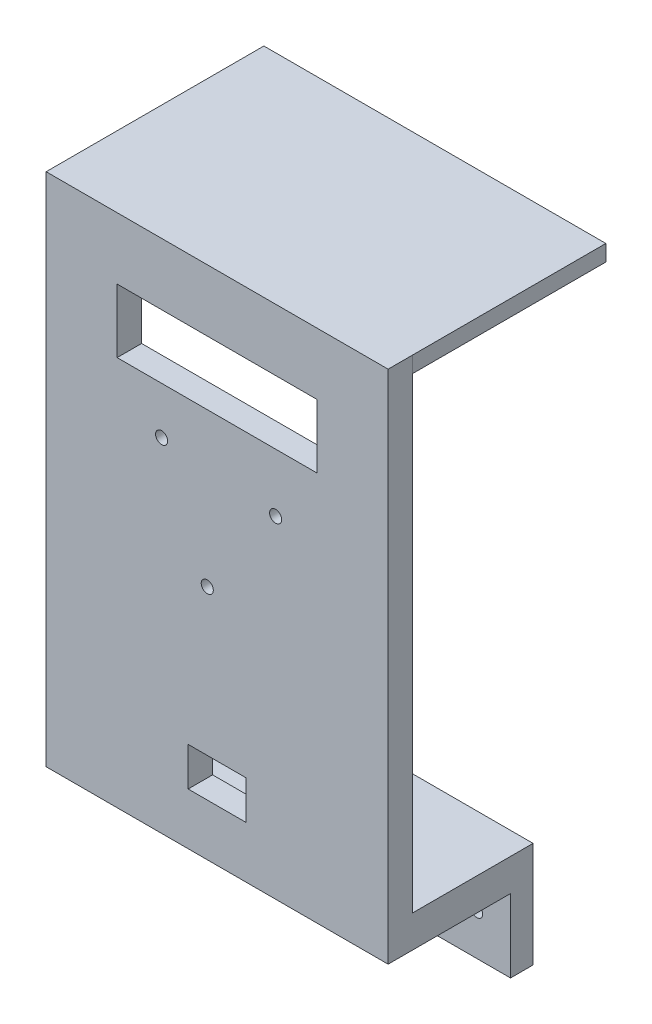
ISO-10303-21;
HEADER;
FILE_DESCRIPTION(('STEP AP214'),'2;1');
FILE_NAME('part.step','',(''),(''),'','','');
FILE_SCHEMA(('AUTOMOTIVE_DESIGN { 1 0 10303 214 1 1 1 1 }'));
ENDSEC;
DATA;
#1=APPLICATION_CONTEXT('core data for automotive mechanical design processes');
#2=APPLICATION_PROTOCOL_DEFINITION('international standard','automotive_design',2000,#1);
#3=PRODUCT_CONTEXT('',#1,'mechanical');
#4=PRODUCT('Part','Part','',(#3));
#5=PRODUCT_RELATED_PRODUCT_CATEGORY('part','',(#4));
#6=PRODUCT_DEFINITION_FORMATION('','',#4);
#7=PRODUCT_DEFINITION_CONTEXT('part definition',#1,'design');
#8=PRODUCT_DEFINITION('design','',#6,#7);
#9=PRODUCT_DEFINITION_SHAPE('','',#8);
#10=(LENGTH_UNIT() NAMED_UNIT(*) SI_UNIT(.MILLI.,.METRE.));
#11=(NAMED_UNIT(*) PLANE_ANGLE_UNIT() SI_UNIT($,.RADIAN.));
#12=(NAMED_UNIT(*) SI_UNIT($,.STERADIAN.) SOLID_ANGLE_UNIT());
#13=UNCERTAINTY_MEASURE_WITH_UNIT(LENGTH_MEASURE(1.E-05),#10,'distance_accuracy_value','');
#14=(GEOMETRIC_REPRESENTATION_CONTEXT(3) GLOBAL_UNCERTAINTY_ASSIGNED_CONTEXT((#13)) GLOBAL_UNIT_ASSIGNED_CONTEXT((#10,
#11,#12)) REPRESENTATION_CONTEXT('',''));
#15=CARTESIAN_POINT('',(0.,0.,0.));
#16=DIRECTION('',(0.,0.,1.));
#17=DIRECTION('',(1.,0.,0.));
#18=AXIS2_PLACEMENT_3D('',#15,#16,#17);
#19=CARTESIAN_POINT('',(-49.7332,-0.987827493568454,15.));
#20=DIRECTION('',(0.,1.,0.));
#21=DIRECTION('',(0.,0.,1.));
#22=AXIS2_PLACEMENT_3D('',#19,#20,#21);
#23=PLANE('',#22);
#24=DIRECTION('',(1.,0.,0.));
#25=VECTOR('',#24,1.);
#26=CARTESIAN_POINT('',(56.4388,-0.987827493568454,6.99999999999999));
#27=LINE('',#26,#25);
#28=CARTESIAN_POINT('',(-49.7332,-0.987827493568454,6.99999999999999));
#29=VERTEX_POINT('',#28);
#30=CARTESIAN_POINT('',(56.4388,-0.987827493568454,6.99999999999999));
#31=VERTEX_POINT('',#30);
#32=EDGE_CURVE('E220',#29,#31,#27,.T.);
#33=ORIENTED_EDGE('',*,*,#32,.F.);
#34=DIRECTION('',(0.,0.,-1.));
#35=VECTOR('',#34,1.);
#36=CARTESIAN_POINT('',(-49.7332,-0.987827493568454,15.));
#37=LINE('',#36,#35);
#38=CARTESIAN_POINT('',(-49.7332,-0.987827493568454,0.));
#39=VERTEX_POINT('',#38);
#40=EDGE_CURVE('E11',#29,#39,#37,.T.);
#41=ORIENTED_EDGE('',*,*,#40,.T.);
#42=DIRECTION('',(1.,0.,0.));
#43=VECTOR('',#42,1.);
#44=CARTESIAN_POINT('',(-49.7332,-0.987827493568454,0.));
#45=LINE('',#44,#43);
#46=CARTESIAN_POINT('',(56.4388,-0.987827493568454,0.));
#47=VERTEX_POINT('',#46);
#48=EDGE_CURVE('E426',#39,#47,#45,.T.);
#49=ORIENTED_EDGE('',*,*,#48,.T.);
#50=DIRECTION('',(0.,0.,-1.));
#51=VECTOR('',#50,1.);
#52=CARTESIAN_POINT('',(56.4388,-0.987827493568454,15.));
#53=LINE('',#52,#51);
#54=EDGE_CURVE('E49',#31,#47,#53,.T.);
#55=ORIENTED_EDGE('',*,*,#54,.F.);
#56=EDGE_LOOP('',(#33,#41,#49,#55));
#57=FACE_BOUND('',#56,.T.);
#58=ADVANCED_FACE('F41',(#57),#23,.F.);
#59=CARTESIAN_POINT('',(56.4388,31.7121725064315,15.));
#60=DIRECTION('',(-1.,0.,0.));
#61=DIRECTION('',(0.,-1.,0.));
#62=AXIS2_PLACEMENT_3D('',#59,#60,#61);
#63=PLANE('',#62);
#64=DIRECTION('',(0.,1.,0.));
#65=VECTOR('',#64,1.);
#66=CARTESIAN_POINT('',(56.4388,21.7217890011297,6.99999999999999));
#67=LINE('',#66,#65);
#68=CARTESIAN_POINT('',(56.4388,21.7217890011297,6.99999999999999));
#69=VERTEX_POINT('',#68);
#70=EDGE_CURVE('E206',#31,#69,#67,.T.);
#71=ORIENTED_EDGE('',*,*,#70,.F.);
#72=ORIENTED_EDGE('',*,*,#54,.T.);
#73=DIRECTION('',(0.,1.,0.));
#74=VECTOR('',#73,1.);
#75=CARTESIAN_POINT('',(56.4388,31.7121725064315,0.));
#76=LINE('',#75,#74);
#77=CARTESIAN_POINT('',(56.4388,31.7121725064315,0.));
#78=VERTEX_POINT('',#77);
#79=EDGE_CURVE('E428',#47,#78,#76,.T.);
#80=ORIENTED_EDGE('',*,*,#79,.T.);
#81=DIRECTION('',(0.,0.,-1.));
#82=VECTOR('',#81,1.);
#83=CARTESIAN_POINT('',(56.4388,31.7121725064315,15.));
#84=LINE('',#83,#82);
#85=CARTESIAN_POINT('',(56.4388,31.7121725064315,37.4020421761508));
#86=VERTEX_POINT('',#85);
#87=EDGE_CURVE('E390',#86,#78,#84,.T.);
#88=ORIENTED_EDGE('',*,*,#87,.F.);
#89=DIRECTION('',(0.,1.,0.));
#90=VECTOR('',#89,1.);
#91=CARTESIAN_POINT('',(56.4388,171.712172506432,37.4020421761508));
#92=LINE('',#91,#90);
#93=CARTESIAN_POINT('',(56.4382329650141,176.712172506432,37.4020421761508));
#94=VERTEX_POINT('',#93);
#95=EDGE_CURVE('E388',#94,#86,#92,.F.);
#96=ORIENTED_EDGE('',*,*,#95,.F.);
#97=CARTESIAN_POINT('',(56.4376659300283,181.712172506432,37.4020421761508));
#98=DIRECTION('',(0.,-1.,0.));
#99=VECTOR('',#98,1.);
#100=LINE('',#97,#99);
#101=CARTESIAN_POINT('',(56.4382329650141,181.712172506432,37.4020421761508));
#102=VERTEX_POINT('',#101);
#103=EDGE_CURVE('E306',#102,#94,#100,.T.);
#104=ORIENTED_EDGE('',*,*,#103,.F.);
#105=DIRECTION('',(0.,0.,-1.));
#106=VECTOR('',#105,1.);
#107=CARTESIAN_POINT('',(56.4388,181.712172506432,45.));
#108=LINE('',#107,#106);
#109=CARTESIAN_POINT('',(56.4388,181.712172506432,45.));
#110=VERTEX_POINT('',#109);
#111=EDGE_CURVE('E374',#110,#102,#108,.T.);
#112=ORIENTED_EDGE('',*,*,#111,.F.);
#113=DIRECTION('',(0.,1.,0.));
#114=VECTOR('',#113,1.);
#115=CARTESIAN_POINT('',(56.4388,31.7121725064315,45.));
#116=LINE('',#115,#114);
#117=CARTESIAN_POINT('',(56.4388,21.7217890011297,45.));
#118=VERTEX_POINT('',#117);
#119=EDGE_CURVE('E400',#118,#110,#116,.T.);
#120=ORIENTED_EDGE('',*,*,#119,.F.);
#121=DIRECTION('',(0.,0.,1.));
#122=VECTOR('',#121,1.);
#123=CARTESIAN_POINT('',(56.4388,21.7217890011297,12.));
#124=LINE('',#123,#122);
#125=EDGE_CURVE('E226',#69,#118,#124,.T.);
#126=ORIENTED_EDGE('',*,*,#125,.F.);
#127=EDGE_LOOP('',(#71,#72,#80,#88,#96,#104,#112,#120,#126));
#128=FACE_BOUND('',#127,.T.);
#129=ADVANCED_FACE('F338',(#128),#63,.F.);
#130=CARTESIAN_POINT('',(56.4388,171.712172506432,37.4020421761508));
#131=DIRECTION('',(0.,0.,1.));
#132=DIRECTION('',(1.,0.,0.));
#133=AXIS2_PLACEMENT_3D('',#130,#131,#132);
#134=PLANE('',#133);
#135=DIRECTION('',(1.,0.,0.));
#136=VECTOR('',#135,1.);
#137=CARTESIAN_POINT('',(56.4388,142.747096855679,37.4020421761508));
#138=LINE('',#137,#136);
#139=CARTESIAN_POINT('',(-27.6946017621445,142.747096855679,37.4020421761508));
#140=VERTEX_POINT('',#139);
#141=CARTESIAN_POINT('',(34.4002017621445,142.747096855679,37.4020421761508));
#142=VERTEX_POINT('',#141);
#143=EDGE_CURVE('E202',#140,#142,#138,.T.);
#144=ORIENTED_EDGE('',*,*,#143,.T.);
#145=DIRECTION('',(0.,1.,0.));
#146=VECTOR('',#145,1.);
#147=CARTESIAN_POINT('',(34.4002017621445,171.712172506432,37.4020421761508));
#148=LINE('',#147,#146);
#149=CARTESIAN_POINT('',(34.4002017621445,162.525734118154,37.4020421761508));
#150=VERTEX_POINT('',#149);
#151=EDGE_CURVE('E207',#142,#150,#148,.T.);
#152=ORIENTED_EDGE('',*,*,#151,.T.);
#153=DIRECTION('',(-1.,0.,0.));
#154=VECTOR('',#153,1.);
#155=CARTESIAN_POINT('',(56.4388,162.525734118154,37.4020421761508));
#156=LINE('',#155,#154);
#157=CARTESIAN_POINT('',(-27.6946017621445,162.525734118154,37.4020421761508));
#158=VERTEX_POINT('',#157);
#159=EDGE_CURVE('E200',#150,#158,#156,.T.);
#160=ORIENTED_EDGE('',*,*,#159,.T.);
#161=DIRECTION('',(0.,-1.,0.));
#162=VECTOR('',#161,1.);
#163=CARTESIAN_POINT('',(-27.6946017621445,171.712172506432,37.4020421761508));
#164=LINE('',#163,#162);
#165=EDGE_CURVE('E178',#158,#140,#164,.T.);
#166=ORIENTED_EDGE('',*,*,#165,.T.);
#167=EDGE_LOOP('',(#144,#152,#160,#166));
#168=FACE_BOUND('',#167,.T.);
#169=CARTESIAN_POINT('',(0.288111980120354,95.1274233828584,37.4020421761508));
#170=DIRECTION('',(0.,0.,1.));
#171=DIRECTION('',(1.,0.,0.));
#172=AXIS2_PLACEMENT_3D('',#169,#170,#171);
#173=CIRCLE('',#172,1.875);
#174=CARTESIAN_POINT('',(2.16311198012035,95.1274233828584,37.4020421761508));
#175=VERTEX_POINT('',#174);
#176=EDGE_CURVE('E253',#175,#175,#173,.T.);
#177=ORIENTED_EDGE('',*,*,#176,.T.);
#178=EDGE_LOOP('',(#177));
#179=FACE_BOUND('',#178,.T.);
#180=CARTESIAN_POINT('',(21.5155373961962,124.701234261049,37.4020421761508));
#181=DIRECTION('',(0.,0.,1.));
#182=DIRECTION('',(1.,0.,0.));
#183=AXIS2_PLACEMENT_3D('',#180,#181,#182);
#184=CIRCLE('',#183,1.875);
#185=CARTESIAN_POINT('',(23.3905373961962,124.701234261049,37.4020421761508));
#186=VERTEX_POINT('',#185);
#187=EDGE_CURVE('E250',#186,#186,#184,.T.);
#188=ORIENTED_EDGE('',*,*,#187,.T.);
#189=EDGE_LOOP('',(#188));
#190=FACE_BOUND('',#189,.T.);
#191=CARTESIAN_POINT('',(-13.8821185720653,128.141421182327,37.4020421761508));
#192=DIRECTION('',(0.,0.,1.));
#193=DIRECTION('',(1.,0.,0.));
#194=AXIS2_PLACEMENT_3D('',#191,#192,#193);
#195=CIRCLE('',#194,1.875);
#196=CARTESIAN_POINT('',(-12.0071185720653,128.141421182327,37.4020421761508));
#197=VERTEX_POINT('',#196);
#198=EDGE_CURVE('E239',#197,#197,#195,.T.);
#199=ORIENTED_EDGE('',*,*,#198,.T.);
#200=EDGE_LOOP('',(#199));
#201=FACE_BOUND('',#200,.T.);
#202=DIRECTION('',(1.,0.,0.));
#203=VECTOR('',#202,1.);
#204=CARTESIAN_POINT('',(56.4388,37.7840898491177,37.4020421761508));
#205=LINE('',#204,#203);
#206=CARTESIAN_POINT('',(-5.64719999999998,37.7840898491177,37.4020421761508));
#207=VERTEX_POINT('',#206);
#208=CARTESIAN_POINT('',(12.3528,37.7840898491177,37.4020421761508));
#209=VERTEX_POINT('',#208);
#210=EDGE_CURVE('E282',#207,#209,#205,.T.);
#211=ORIENTED_EDGE('',*,*,#210,.T.);
#212=DIRECTION('',(0.,1.,0.));
#213=VECTOR('',#212,1.);
#214=CARTESIAN_POINT('',(12.3528,171.712172506432,37.4020421761508));
#215=LINE('',#214,#213);
#216=CARTESIAN_POINT('',(12.3528,49.7840898491177,37.4020421761508));
#217=VERTEX_POINT('',#216);
#218=EDGE_CURVE('E281',#209,#217,#215,.T.);
#219=ORIENTED_EDGE('',*,*,#218,.T.);
#220=DIRECTION('',(-1.,0.,0.));
#221=VECTOR('',#220,1.);
#222=CARTESIAN_POINT('',(56.4388,49.7840898491177,37.4020421761508));
#223=LINE('',#222,#221);
#224=CARTESIAN_POINT('',(-5.64719999999998,49.7840898491177,37.4020421761508));
#225=VERTEX_POINT('',#224);
#226=EDGE_CURVE('E267',#217,#225,#223,.T.);
#227=ORIENTED_EDGE('',*,*,#226,.T.);
#228=DIRECTION('',(0.,-1.,0.));
#229=VECTOR('',#228,1.);
#230=CARTESIAN_POINT('',(-5.64719999999998,171.712172506432,37.4020421761508));
#231=LINE('',#230,#229);
#232=EDGE_CURVE('E277',#225,#207,#231,.T.);
#233=ORIENTED_EDGE('',*,*,#232,.T.);
#234=EDGE_LOOP('',(#211,#219,#227,#233));
#235=FACE_BOUND('',#234,.T.);
#236=DIRECTION('',(-1.,0.,0.));
#237=VECTOR('',#236,1.);
#238=CARTESIAN_POINT('',(-49.7332,176.712172506432,37.4020421761508));
#239=LINE('',#238,#237);
#240=CARTESIAN_POINT('',(-49.7332,176.712172506432,37.4020421761508));
#241=VERTEX_POINT('',#240);
#242=EDGE_CURVE('E289',#94,#241,#239,.T.);
#243=ORIENTED_EDGE('',*,*,#242,.F.);
#244=ORIENTED_EDGE('',*,*,#95,.T.);
#245=DIRECTION('',(-1.,0.,0.));
#246=VECTOR('',#245,1.);
#247=CARTESIAN_POINT('',(56.4388,31.7121725064315,37.4020421761508));
#248=LINE('',#247,#246);
#249=CARTESIAN_POINT('',(-49.7332,31.7121725064315,37.4020421761508));
#250=VERTEX_POINT('',#249);
#251=EDGE_CURVE('E385',#86,#250,#248,.T.);
#252=ORIENTED_EDGE('',*,*,#251,.T.);
#253=DIRECTION('',(0.,-1.,0.));
#254=VECTOR('',#253,1.);
#255=CARTESIAN_POINT('',(-49.7332,171.712172506432,37.4020421761508));
#256=LINE('',#255,#254);
#257=EDGE_CURVE('E383',#241,#250,#256,.T.);
#258=ORIENTED_EDGE('',*,*,#257,.F.);
#259=EDGE_LOOP('',(#243,#244,#252,#258));
#260=FACE_BOUND('',#259,.T.);
#261=ADVANCED_FACE('F331',(#168,#179,#190,#201,#235,#260),#134,.F.);
#262=CARTESIAN_POINT('',(-49.7332,31.7121725064315,15.));
#263=DIRECTION('',(1.,0.,0.));
#264=DIRECTION('',(0.,1.,0.));
#265=AXIS2_PLACEMENT_3D('',#262,#263,#264);
#266=PLANE('',#265);
#267=DIRECTION('',(0.,-1.,0.));
#268=VECTOR('',#267,1.);
#269=CARTESIAN_POINT('',(-49.7332,21.7217890011297,6.99999999999999));
#270=LINE('',#269,#268);
#271=CARTESIAN_POINT('',(-49.7332,21.7217890011297,6.99999999999999));
#272=VERTEX_POINT('',#271);
#273=EDGE_CURVE('E213',#272,#29,#270,.T.);
#274=ORIENTED_EDGE('',*,*,#273,.F.);
#275=DIRECTION('',(0.,0.,1.));
#276=VECTOR('',#275,1.);
#277=CARTESIAN_POINT('',(-49.7332,21.7217890011297,12.));
#278=LINE('',#277,#276);
#279=CARTESIAN_POINT('',(-49.7332,21.7217890011297,45.));
#280=VERTEX_POINT('',#279);
#281=EDGE_CURVE('E228',#272,#280,#278,.T.);
#282=ORIENTED_EDGE('',*,*,#281,.T.);
#283=DIRECTION('',(0.,-1.,0.));
#284=VECTOR('',#283,1.);
#285=CARTESIAN_POINT('',(-49.7332,31.7121725064315,45.));
#286=LINE('',#285,#284);
#287=CARTESIAN_POINT('',(-49.7332,181.712172506432,45.));
#288=VERTEX_POINT('',#287);
#289=EDGE_CURVE('E406',#288,#280,#286,.T.);
#290=ORIENTED_EDGE('',*,*,#289,.F.);
#291=DIRECTION('',(0.,0.,1.));
#292=VECTOR('',#291,1.);
#293=CARTESIAN_POINT('',(-49.7332,181.712172506432,45.));
#294=LINE('',#293,#292);
#295=CARTESIAN_POINT('',(-49.7332,181.712172506432,-22.5979578238492));
#296=VERTEX_POINT('',#295);
#297=EDGE_CURVE('E376',#296,#288,#294,.T.);
#298=ORIENTED_EDGE('',*,*,#297,.F.);
#299=DIRECTION('',(0.,1.,0.));
#300=VECTOR('',#299,1.);
#301=CARTESIAN_POINT('',(-49.7332,181.712172506432,-22.5979578238492));
#302=LINE('',#301,#300);
#303=CARTESIAN_POINT('',(-49.7332,176.712172506432,-22.5979578238492));
#304=VERTEX_POINT('',#303);
#305=EDGE_CURVE('E286',#304,#296,#302,.T.);
#306=ORIENTED_EDGE('',*,*,#305,.F.);
#307=DIRECTION('',(0.,0.,1.));
#308=VECTOR('',#307,1.);
#309=CARTESIAN_POINT('',(-49.7332,176.712172506432,-22.5979578238492));
#310=LINE('',#309,#308);
#311=EDGE_CURVE('E300',#304,#241,#310,.T.);
#312=ORIENTED_EDGE('',*,*,#311,.T.);
#313=ORIENTED_EDGE('',*,*,#257,.T.);
#314=DIRECTION('',(0.,0.,-1.));
#315=VECTOR('',#314,1.);
#316=CARTESIAN_POINT('',(-49.7332,31.7121725064315,15.));
#317=LINE('',#316,#315);
#318=CARTESIAN_POINT('',(-49.7332,31.7121725064315,0.));
#319=VERTEX_POINT('',#318);
#320=EDGE_CURVE('E386',#250,#319,#317,.T.);
#321=ORIENTED_EDGE('',*,*,#320,.T.);
#322=DIRECTION('',(0.,-1.,0.));
#323=VECTOR('',#322,1.);
#324=CARTESIAN_POINT('',(-49.7332,31.7121725064315,0.));
#325=LINE('',#324,#323);
#326=EDGE_CURVE('E423',#319,#39,#325,.T.);
#327=ORIENTED_EDGE('',*,*,#326,.T.);
#328=ORIENTED_EDGE('',*,*,#40,.F.);
#329=EDGE_LOOP('',(#274,#282,#290,#298,#306,#312,#313,#321,#327,#328));
#330=FACE_BOUND('',#329,.T.);
#331=ADVANCED_FACE('F43',(#330),#266,.F.);
#332=CARTESIAN_POINT('',(0.,0.,45.));
#333=DIRECTION('',(0.,0.,-1.));
#334=DIRECTION('',(-1.,0.,0.));
#335=AXIS2_PLACEMENT_3D('',#332,#333,#334);
#336=PLANE('',#335);
#337=DIRECTION('',(-1.,0.,0.));
#338=VECTOR('',#337,1.);
#339=CARTESIAN_POINT('',(34.4002017621445,162.525734118154,45.));
#340=LINE('',#339,#338);
#341=CARTESIAN_POINT('',(34.4002017621445,162.525734118154,45.));
#342=VERTEX_POINT('',#341);
#343=CARTESIAN_POINT('',(-27.6946017621445,162.525734118154,45.));
#344=VERTEX_POINT('',#343);
#345=EDGE_CURVE('E181',#342,#344,#340,.T.);
#346=ORIENTED_EDGE('',*,*,#345,.F.);
#347=DIRECTION('',(0.,1.,0.));
#348=VECTOR('',#347,1.);
#349=CARTESIAN_POINT('',(34.4002017621445,142.747096855679,45.));
#350=LINE('',#349,#348);
#351=CARTESIAN_POINT('',(34.4002017621445,142.747096855679,45.));
#352=VERTEX_POINT('',#351);
#353=EDGE_CURVE('E66',#352,#342,#350,.T.);
#354=ORIENTED_EDGE('',*,*,#353,.F.);
#355=DIRECTION('',(1.,0.,0.));
#356=VECTOR('',#355,1.);
#357=CARTESIAN_POINT('',(34.4002017621445,142.747096855679,45.));
#358=LINE('',#357,#356);
#359=CARTESIAN_POINT('',(-27.6946017621445,142.747096855679,45.));
#360=VERTEX_POINT('',#359);
#361=EDGE_CURVE('E187',#360,#352,#358,.T.);
#362=ORIENTED_EDGE('',*,*,#361,.F.);
#363=DIRECTION('',(0.,-1.,0.));
#364=VECTOR('',#363,1.);
#365=CARTESIAN_POINT('',(-27.6946017621445,142.747096855679,45.));
#366=LINE('',#365,#364);
#367=EDGE_CURVE('E175',#344,#360,#366,.T.);
#368=ORIENTED_EDGE('',*,*,#367,.F.);
#369=EDGE_LOOP('',(#346,#354,#362,#368));
#370=FACE_BOUND('',#369,.T.);
#371=CARTESIAN_POINT('',(0.288111980120354,95.1274233828584,45.));
#372=DIRECTION('',(0.,0.,1.));
#373=DIRECTION('',(1.,0.,0.));
#374=AXIS2_PLACEMENT_3D('',#371,#372,#373);
#375=CIRCLE('',#374,1.875);
#376=CARTESIAN_POINT('',(2.16311198012035,95.1274233828584,45.));
#377=VERTEX_POINT('',#376);
#378=EDGE_CURVE('E233',#377,#377,#375,.T.);
#379=ORIENTED_EDGE('',*,*,#378,.F.);
#380=EDGE_LOOP('',(#379));
#381=FACE_BOUND('',#380,.T.);
#382=CARTESIAN_POINT('',(21.5155373961962,124.701234261049,45.));
#383=DIRECTION('',(0.,0.,1.));
#384=DIRECTION('',(1.,0.,0.));
#385=AXIS2_PLACEMENT_3D('',#382,#383,#384);
#386=CIRCLE('',#385,1.875);
#387=CARTESIAN_POINT('',(23.3905373961962,124.701234261049,45.));
#388=VERTEX_POINT('',#387);
#389=EDGE_CURVE('E236',#388,#388,#386,.T.);
#390=ORIENTED_EDGE('',*,*,#389,.F.);
#391=EDGE_LOOP('',(#390));
#392=FACE_BOUND('',#391,.T.);
#393=CARTESIAN_POINT('',(-13.8821185720653,128.141421182327,45.));
#394=DIRECTION('',(0.,0.,1.));
#395=DIRECTION('',(1.,0.,0.));
#396=AXIS2_PLACEMENT_3D('',#393,#394,#395);
#397=CIRCLE('',#396,1.875);
#398=CARTESIAN_POINT('',(-12.0071185720653,128.141421182327,45.));
#399=VERTEX_POINT('',#398);
#400=EDGE_CURVE('E231',#399,#399,#397,.T.);
#401=ORIENTED_EDGE('',*,*,#400,.F.);
#402=EDGE_LOOP('',(#401));
#403=FACE_BOUND('',#402,.T.);
#404=DIRECTION('',(-1.,0.,0.));
#405=VECTOR('',#404,1.);
#406=CARTESIAN_POINT('',(12.3528,49.7840898491177,45.));
#407=LINE('',#406,#405);
#408=CARTESIAN_POINT('',(12.3528,49.7840898491177,45.));
#409=VERTEX_POINT('',#408);
#410=CARTESIAN_POINT('',(-5.64719999999998,49.7840898491177,45.));
#411=VERTEX_POINT('',#410);
#412=EDGE_CURVE('E258',#409,#411,#407,.T.);
#413=ORIENTED_EDGE('',*,*,#412,.F.);
#414=DIRECTION('',(0.,1.,0.));
#415=VECTOR('',#414,1.);
#416=CARTESIAN_POINT('',(12.3528,49.7840898491177,45.));
#417=LINE('',#416,#415);
#418=CARTESIAN_POINT('',(12.3528,37.7840898491177,45.));
#419=VERTEX_POINT('',#418);
#420=EDGE_CURVE('E254',#419,#409,#417,.T.);
#421=ORIENTED_EDGE('',*,*,#420,.F.);
#422=DIRECTION('',(1.,0.,0.));
#423=VECTOR('',#422,1.);
#424=CARTESIAN_POINT('',(12.3528,37.7840898491177,45.));
#425=LINE('',#424,#423);
#426=CARTESIAN_POINT('',(-5.64719999999998,37.7840898491177,45.));
#427=VERTEX_POINT('',#426);
#428=EDGE_CURVE('E261',#427,#419,#425,.T.);
#429=ORIENTED_EDGE('',*,*,#428,.F.);
#430=DIRECTION('',(0.,-1.,0.));
#431=VECTOR('',#430,1.);
#432=CARTESIAN_POINT('',(-5.64719999999998,49.7840898491177,45.));
#433=LINE('',#432,#431);
#434=EDGE_CURVE('E259',#411,#427,#433,.T.);
#435=ORIENTED_EDGE('',*,*,#434,.F.);
#436=EDGE_LOOP('',(#413,#421,#429,#435));
#437=FACE_BOUND('',#436,.T.);
#438=DIRECTION('',(-1.,0.,0.));
#439=VECTOR('',#438,1.);
#440=CARTESIAN_POINT('',(96.2668,21.7217890011297,45.));
#441=LINE('',#440,#439);
#442=EDGE_CURVE('E387',#118,#280,#441,.T.);
#443=ORIENTED_EDGE('',*,*,#442,.F.);
#444=ORIENTED_EDGE('',*,*,#119,.T.);
#445=DIRECTION('',(1.,0.,0.));
#446=VECTOR('',#445,1.);
#447=CARTESIAN_POINT('',(56.4388,181.712172506432,45.));
#448=LINE('',#447,#446);
#449=EDGE_CURVE('E463',#288,#110,#448,.T.);
#450=ORIENTED_EDGE('',*,*,#449,.F.);
#451=ORIENTED_EDGE('',*,*,#289,.T.);
#452=EDGE_LOOP('',(#443,#444,#450,#451));
#453=FACE_BOUND('',#452,.T.);
#454=ADVANCED_FACE('F190',(#370,#381,#392,#403,#437,#453),#336,.F.);
#455=CARTESIAN_POINT('',(-49.7332,31.7121725064315,15.));
#456=DIRECTION('',(0.,-1.,0.));
#457=DIRECTION('',(0.,0.,-1.));
#458=AXIS2_PLACEMENT_3D('',#455,#456,#457);
#459=PLANE('',#458);
#460=ORIENTED_EDGE('',*,*,#251,.F.);
#461=ORIENTED_EDGE('',*,*,#87,.T.);
#462=DIRECTION('',(-1.,0.,0.));
#463=VECTOR('',#462,1.);
#464=CARTESIAN_POINT('',(-49.7332,31.7121725064315,0.));
#465=LINE('',#464,#463);
#466=EDGE_CURVE('E435',#78,#319,#465,.T.);
#467=ORIENTED_EDGE('',*,*,#466,.T.);
#468=ORIENTED_EDGE('',*,*,#320,.F.);
#469=EDGE_LOOP('',(#460,#461,#467,#468));
#470=FACE_BOUND('',#469,.T.);
#471=ADVANCED_FACE('F337',(#470),#459,.F.);
#472=CARTESIAN_POINT('',(0.,0.,0.));
#473=DIRECTION('',(0.,0.,1.));
#474=DIRECTION('',(1.,0.,0.));
#475=AXIS2_PLACEMENT_3D('',#472,#473,#474);
#476=PLANE('',#475);
#477=ORIENTED_EDGE('',*,*,#326,.F.);
#478=ORIENTED_EDGE('',*,*,#466,.F.);
#479=ORIENTED_EDGE('',*,*,#79,.F.);
#480=ORIENTED_EDGE('',*,*,#48,.F.);
#481=EDGE_LOOP('',(#477,#478,#479,#480));
#482=FACE_BOUND('',#481,.T.);
#483=CARTESIAN_POINT('',(46.0248,11.8121725064315,0.));
#484=DIRECTION('',(0.,0.,1.));
#485=DIRECTION('',(1.,0.,0.));
#486=AXIS2_PLACEMENT_3D('',#483,#484,#485);
#487=CIRCLE('',#486,1.778);
#488=CARTESIAN_POINT('',(47.8028,11.8121725064315,0.));
#489=VERTEX_POINT('',#488);
#490=EDGE_CURVE('E419',#489,#489,#487,.T.);
#491=ORIENTED_EDGE('',*,*,#490,.T.);
#492=EDGE_LOOP('',(#491));
#493=FACE_BOUND('',#492,.T.);
#494=CARTESIAN_POINT('',(34.8488,11.8121725064315,0.));
#495=DIRECTION('',(0.,0.,1.));
#496=DIRECTION('',(1.,0.,0.));
#497=AXIS2_PLACEMENT_3D('',#494,#495,#496);
#498=CIRCLE('',#497,1.778);
#499=CARTESIAN_POINT('',(36.6268,11.8121725064315,0.));
#500=VERTEX_POINT('',#499);
#501=EDGE_CURVE('E420',#500,#500,#498,.T.);
#502=ORIENTED_EDGE('',*,*,#501,.T.);
#503=EDGE_LOOP('',(#502));
#504=FACE_BOUND('',#503,.T.);
#505=CARTESIAN_POINT('',(-38.7332,12.0121725064315,0.));
#506=DIRECTION('',(0.,0.,1.));
#507=DIRECTION('',(1.,0.,0.));
#508=AXIS2_PLACEMENT_3D('',#505,#506,#507);
#509=CIRCLE('',#508,1.778);
#510=CARTESIAN_POINT('',(-36.9552,12.0121725064315,0.));
#511=VERTEX_POINT('',#510);
#512=EDGE_CURVE('E414',#511,#511,#509,.T.);
#513=ORIENTED_EDGE('',*,*,#512,.T.);
#514=EDGE_LOOP('',(#513));
#515=FACE_BOUND('',#514,.T.);
#516=CARTESIAN_POINT('',(-27.5332,12.0121725064315,0.));
#517=DIRECTION('',(0.,0.,1.));
#518=DIRECTION('',(1.,0.,0.));
#519=AXIS2_PLACEMENT_3D('',#516,#517,#518);
#520=CIRCLE('',#519,1.77800000000001);
#521=CARTESIAN_POINT('',(-25.7552,12.0121725064315,0.));
#522=VERTEX_POINT('',#521);
#523=EDGE_CURVE('E413',#522,#522,#520,.T.);
#524=ORIENTED_EDGE('',*,*,#523,.T.);
#525=EDGE_LOOP('',(#524));
#526=FACE_BOUND('',#525,.T.);
#527=ADVANCED_FACE('F354',(#482,#493,#504,#515,#526),#476,.F.);
#528=CARTESIAN_POINT('',(46.0248,11.8121725064315,15.));
#529=DIRECTION('',(0.,0.,-1.));
#530=DIRECTION('',(-1.,0.,0.));
#531=AXIS2_PLACEMENT_3D('',#528,#529,#530);
#532=CYLINDRICAL_SURFACE('',#531,1.778);
#533=CARTESIAN_POINT('',(46.0248,11.8121725064315,6.99999999999999));
#534=DIRECTION('',(0.,0.,-1.));
#535=DIRECTION('',(-1.,0.,0.));
#536=AXIS2_PLACEMENT_3D('',#533,#534,#535);
#537=CIRCLE('',#536,1.778);
#538=CARTESIAN_POINT('',(44.2468,11.8121725064315,6.99999999999999));
#539=VERTEX_POINT('',#538);
#540=EDGE_CURVE('E227',#539,#539,#537,.T.);
#541=ORIENTED_EDGE('',*,*,#540,.F.);
#542=EDGE_LOOP('',(#541));
#543=FACE_BOUND('',#542,.T.);
#544=ORIENTED_EDGE('',*,*,#490,.F.);
#545=EDGE_LOOP('',(#544));
#546=FACE_BOUND('',#545,.T.);
#547=ADVANCED_FACE('F351',(#543,#546),#532,.F.);
#548=CARTESIAN_POINT('',(34.8488,11.8121725064315,15.));
#549=DIRECTION('',(0.,0.,-1.));
#550=DIRECTION('',(-1.,0.,0.));
#551=AXIS2_PLACEMENT_3D('',#548,#549,#550);
#552=CYLINDRICAL_SURFACE('',#551,1.778);
#553=CARTESIAN_POINT('',(34.8488,11.8121725064315,6.99999999999999));
#554=DIRECTION('',(0.,0.,-1.));
#555=DIRECTION('',(-1.,0.,0.));
#556=AXIS2_PLACEMENT_3D('',#553,#554,#555);
#557=CIRCLE('',#556,1.778);
#558=CARTESIAN_POINT('',(33.0708,11.8121725064315,6.99999999999999));
#559=VERTEX_POINT('',#558);
#560=EDGE_CURVE('E221',#559,#559,#557,.T.);
#561=ORIENTED_EDGE('',*,*,#560,.F.);
#562=EDGE_LOOP('',(#561));
#563=FACE_BOUND('',#562,.T.);
#564=ORIENTED_EDGE('',*,*,#501,.F.);
#565=EDGE_LOOP('',(#564));
#566=FACE_BOUND('',#565,.T.);
#567=ADVANCED_FACE('F350',(#563,#566),#552,.F.);
#568=CARTESIAN_POINT('',(-38.7332,12.0121725064315,15.));
#569=DIRECTION('',(0.,0.,-1.));
#570=DIRECTION('',(-1.,0.,0.));
#571=AXIS2_PLACEMENT_3D('',#568,#569,#570);
#572=CYLINDRICAL_SURFACE('',#571,1.778);
#573=CARTESIAN_POINT('',(-38.7332,12.0121725064315,6.99999999999999));
#574=DIRECTION('',(0.,0.,-1.));
#575=DIRECTION('',(-1.,0.,0.));
#576=AXIS2_PLACEMENT_3D('',#573,#574,#575);
#577=CIRCLE('',#576,1.778);
#578=CARTESIAN_POINT('',(-40.5112,12.0121725064315,6.99999999999999));
#579=VERTEX_POINT('',#578);
#580=EDGE_CURVE('E217',#579,#579,#577,.T.);
#581=ORIENTED_EDGE('',*,*,#580,.F.);
#582=EDGE_LOOP('',(#581));
#583=FACE_BOUND('',#582,.T.);
#584=ORIENTED_EDGE('',*,*,#512,.F.);
#585=EDGE_LOOP('',(#584));
#586=FACE_BOUND('',#585,.T.);
#587=ADVANCED_FACE('F343',(#583,#586),#572,.F.);
#588=CARTESIAN_POINT('',(-27.5332,12.0121725064315,15.));
#589=DIRECTION('',(0.,0.,-1.));
#590=DIRECTION('',(-1.,0.,0.));
#591=AXIS2_PLACEMENT_3D('',#588,#589,#590);
#592=CYLINDRICAL_SURFACE('',#591,1.77800000000001);
#593=CARTESIAN_POINT('',(-27.5332,12.0121725064315,6.99999999999999));
#594=DIRECTION('',(0.,0.,-1.));
#595=DIRECTION('',(-1.,0.,0.));
#596=AXIS2_PLACEMENT_3D('',#593,#594,#595);
#597=CIRCLE('',#596,1.77800000000001);
#598=CARTESIAN_POINT('',(-29.3112,12.0121725064315,6.99999999999999));
#599=VERTEX_POINT('',#598);
#600=EDGE_CURVE('E44',#599,#599,#597,.T.);
#601=ORIENTED_EDGE('',*,*,#600,.F.);
#602=EDGE_LOOP('',(#601));
#603=FACE_BOUND('',#602,.T.);
#604=ORIENTED_EDGE('',*,*,#523,.F.);
#605=EDGE_LOOP('',(#604));
#606=FACE_BOUND('',#605,.T.);
#607=ADVANCED_FACE('F333',(#603,#606),#592,.F.);
#608=CARTESIAN_POINT('',(0.,181.712172506432,0.));
#609=DIRECTION('',(0.,1.,0.));
#610=DIRECTION('',(0.,0.,1.));
#611=AXIS2_PLACEMENT_3D('',#608,#609,#610);
#612=PLANE('',#611);
#613=ORIENTED_EDGE('',*,*,#111,.T.);
#614=DIRECTION('',(0.,0.,1.));
#615=VECTOR('',#614,1.);
#616=CARTESIAN_POINT('',(56.4376659300283,181.712172506432,-22.5979578238492));
#617=LINE('',#616,#615);
#618=CARTESIAN_POINT('',(56.4376659300283,181.712172506432,-22.5979578238492));
#619=VERTEX_POINT('',#618);
#620=EDGE_CURVE('E311',#619,#102,#617,.T.);
#621=ORIENTED_EDGE('',*,*,#620,.F.);
#622=DIRECTION('',(1.,0.,0.));
#623=VECTOR('',#622,1.);
#624=CARTESIAN_POINT('',(-49.7332,181.712172506432,-22.5979578238492));
#625=LINE('',#624,#623);
#626=EDGE_CURVE('E295',#296,#619,#625,.T.);
#627=ORIENTED_EDGE('',*,*,#626,.F.);
#628=ORIENTED_EDGE('',*,*,#297,.T.);
#629=ORIENTED_EDGE('',*,*,#449,.T.);
#630=EDGE_LOOP('',(#613,#621,#627,#628,#629));
#631=FACE_BOUND('',#630,.T.);
#632=ADVANCED_FACE('F330',(#631),#612,.T.);
#633=CARTESIAN_POINT('',(56.4376659300283,181.712172506432,-22.5979578238492));
#634=DIRECTION('',(-1.,0.,0.));
#635=DIRECTION('',(0.,0.,1.));
#636=AXIS2_PLACEMENT_3D('',#633,#634,#635);
#637=PLANE('',#636);
#638=ORIENTED_EDGE('',*,*,#103,.T.);
#639=DIRECTION('',(0.,0.,1.));
#640=VECTOR('',#639,1.);
#641=CARTESIAN_POINT('',(56.4376659300283,176.712172506432,-22.5979578238492));
#642=LINE('',#641,#640);
#643=CARTESIAN_POINT('',(56.4376659300283,176.712172506432,-22.5979578238492));
#644=VERTEX_POINT('',#643);
#645=EDGE_CURVE('E304',#644,#94,#642,.T.);
#646=ORIENTED_EDGE('',*,*,#645,.F.);
#647=DIRECTION('',(0.,-1.,0.));
#648=VECTOR('',#647,1.);
#649=CARTESIAN_POINT('',(56.4376659300283,181.712172506432,-22.5979578238492));
#650=LINE('',#649,#648);
#651=EDGE_CURVE('E292',#619,#644,#650,.T.);
#652=ORIENTED_EDGE('',*,*,#651,.F.);
#653=ORIENTED_EDGE('',*,*,#620,.T.);
#654=EDGE_LOOP('',(#638,#646,#652,#653));
#655=FACE_BOUND('',#654,.T.);
#656=ADVANCED_FACE('F316',(#655),#637,.F.);
#657=CARTESIAN_POINT('',(-49.7332,176.712172506432,-22.5979578238492));
#658=DIRECTION('',(0.,1.,0.));
#659=DIRECTION('',(0.,0.,1.));
#660=AXIS2_PLACEMENT_3D('',#657,#658,#659);
#661=PLANE('',#660);
#662=ORIENTED_EDGE('',*,*,#242,.T.);
#663=ORIENTED_EDGE('',*,*,#311,.F.);
#664=DIRECTION('',(-1.,0.,0.));
#665=VECTOR('',#664,1.);
#666=CARTESIAN_POINT('',(-49.7332,176.712172506432,-22.5979578238492));
#667=LINE('',#666,#665);
#668=EDGE_CURVE('E299',#644,#304,#667,.T.);
#669=ORIENTED_EDGE('',*,*,#668,.F.);
#670=ORIENTED_EDGE('',*,*,#645,.T.);
#671=EDGE_LOOP('',(#662,#663,#669,#670));
#672=FACE_BOUND('',#671,.T.);
#673=ADVANCED_FACE('F328',(#672),#661,.F.);
#674=CARTESIAN_POINT('',(0.,0.,-22.5979578238492));
#675=DIRECTION('',(0.,0.,1.));
#676=DIRECTION('',(1.,0.,0.));
#677=AXIS2_PLACEMENT_3D('',#674,#675,#676);
#678=PLANE('',#677);
#679=ORIENTED_EDGE('',*,*,#305,.T.);
#680=ORIENTED_EDGE('',*,*,#626,.T.);
#681=ORIENTED_EDGE('',*,*,#651,.T.);
#682=ORIENTED_EDGE('',*,*,#668,.T.);
#683=EDGE_LOOP('',(#679,#680,#681,#682));
#684=FACE_BOUND('',#683,.T.);
#685=ADVANCED_FACE('F484',(#684),#678,.F.);
#686=CARTESIAN_POINT('',(12.3528,49.7840898491177,37.2));
#687=DIRECTION('',(1.,0.,0.));
#688=DIRECTION('',(0.,0.,-1.));
#689=AXIS2_PLACEMENT_3D('',#686,#687,#688);
#690=PLANE('',#689);
#691=DIRECTION('',(0.,0.,1.));
#692=VECTOR('',#691,1.);
#693=CARTESIAN_POINT('',(12.3528,37.7840898491177,37.2));
#694=LINE('',#693,#692);
#695=EDGE_CURVE('E270',#209,#419,#694,.T.);
#696=ORIENTED_EDGE('',*,*,#695,.T.);
#697=ORIENTED_EDGE('',*,*,#420,.T.);
#698=DIRECTION('',(0.,0.,1.));
#699=VECTOR('',#698,1.);
#700=CARTESIAN_POINT('',(12.3528,49.7840898491177,37.2));
#701=LINE('',#700,#699);
#702=EDGE_CURVE('E266',#217,#409,#701,.T.);
#703=ORIENTED_EDGE('',*,*,#702,.F.);
#704=ORIENTED_EDGE('',*,*,#218,.F.);
#705=EDGE_LOOP('',(#696,#697,#703,#704));
#706=FACE_BOUND('',#705,.T.);
#707=ADVANCED_FACE('F490',(#706),#690,.F.);
#708=CARTESIAN_POINT('',(12.3528,37.7840898491177,37.2));
#709=DIRECTION('',(0.,-1.,0.));
#710=DIRECTION('',(0.,0.,-1.));
#711=AXIS2_PLACEMENT_3D('',#708,#709,#710);
#712=PLANE('',#711);
#713=DIRECTION('',(0.,0.,1.));
#714=VECTOR('',#713,1.);
#715=CARTESIAN_POINT('',(-5.64719999999998,37.7840898491177,37.2));
#716=LINE('',#715,#714);
#717=EDGE_CURVE('E269',#207,#427,#716,.T.);
#718=ORIENTED_EDGE('',*,*,#717,.T.);
#719=ORIENTED_EDGE('',*,*,#428,.T.);
#720=ORIENTED_EDGE('',*,*,#695,.F.);
#721=ORIENTED_EDGE('',*,*,#210,.F.);
#722=EDGE_LOOP('',(#718,#719,#720,#721));
#723=FACE_BOUND('',#722,.T.);
#724=ADVANCED_FACE('F495',(#723),#712,.F.);
#725=CARTESIAN_POINT('',(-5.64719999999998,49.7840898491177,37.2));
#726=DIRECTION('',(-1.,0.,0.));
#727=DIRECTION('',(0.,0.,1.));
#728=AXIS2_PLACEMENT_3D('',#725,#726,#727);
#729=PLANE('',#728);
#730=DIRECTION('',(0.,0.,1.));
#731=VECTOR('',#730,1.);
#732=CARTESIAN_POINT('',(-5.64719999999998,49.7840898491177,37.2));
#733=LINE('',#732,#731);
#734=EDGE_CURVE('E275',#225,#411,#733,.T.);
#735=ORIENTED_EDGE('',*,*,#734,.T.);
#736=ORIENTED_EDGE('',*,*,#434,.T.);
#737=ORIENTED_EDGE('',*,*,#717,.F.);
#738=ORIENTED_EDGE('',*,*,#232,.F.);
#739=EDGE_LOOP('',(#735,#736,#737,#738));
#740=FACE_BOUND('',#739,.T.);
#741=ADVANCED_FACE('F594',(#740),#729,.F.);
#742=CARTESIAN_POINT('',(12.3528,49.7840898491177,37.2));
#743=DIRECTION('',(0.,1.,0.));
#744=DIRECTION('',(0.,0.,1.));
#745=AXIS2_PLACEMENT_3D('',#742,#743,#744);
#746=PLANE('',#745);
#747=ORIENTED_EDGE('',*,*,#702,.T.);
#748=ORIENTED_EDGE('',*,*,#412,.T.);
#749=ORIENTED_EDGE('',*,*,#734,.F.);
#750=ORIENTED_EDGE('',*,*,#226,.F.);
#751=EDGE_LOOP('',(#747,#748,#749,#750));
#752=FACE_BOUND('',#751,.T.);
#753=ADVANCED_FACE('F591',(#752),#746,.F.);
#754=CARTESIAN_POINT('',(-13.8821185720653,128.141421182327,35.));
#755=DIRECTION('',(0.,0.,1.));
#756=DIRECTION('',(1.,0.,0.));
#757=AXIS2_PLACEMENT_3D('',#754,#755,#756);
#758=CYLINDRICAL_SURFACE('',#757,1.875);
#759=ORIENTED_EDGE('',*,*,#400,.T.);
#760=EDGE_LOOP('',(#759));
#761=FACE_BOUND('',#760,.T.);
#762=ORIENTED_EDGE('',*,*,#198,.F.);
#763=EDGE_LOOP('',(#762));
#764=FACE_BOUND('',#763,.T.);
#765=ADVANCED_FACE('F590',(#761,#764),#758,.F.);
#766=CARTESIAN_POINT('',(21.5155373961962,124.701234261049,35.));
#767=DIRECTION('',(0.,0.,1.));
#768=DIRECTION('',(1.,0.,0.));
#769=AXIS2_PLACEMENT_3D('',#766,#767,#768);
#770=CYLINDRICAL_SURFACE('',#769,1.875);
#771=ORIENTED_EDGE('',*,*,#389,.T.);
#772=EDGE_LOOP('',(#771));
#773=FACE_BOUND('',#772,.T.);
#774=ORIENTED_EDGE('',*,*,#187,.F.);
#775=EDGE_LOOP('',(#774));
#776=FACE_BOUND('',#775,.T.);
#777=ADVANCED_FACE('F584',(#773,#776),#770,.F.);
#778=CARTESIAN_POINT('',(0.288111980120354,95.1274233828584,35.));
#779=DIRECTION('',(0.,0.,1.));
#780=DIRECTION('',(1.,0.,0.));
#781=AXIS2_PLACEMENT_3D('',#778,#779,#780);
#782=CYLINDRICAL_SURFACE('',#781,1.875);
#783=ORIENTED_EDGE('',*,*,#378,.T.);
#784=EDGE_LOOP('',(#783));
#785=FACE_BOUND('',#784,.T.);
#786=ORIENTED_EDGE('',*,*,#176,.F.);
#787=EDGE_LOOP('',(#786));
#788=FACE_BOUND('',#787,.T.);
#789=ADVANCED_FACE('F518',(#785,#788),#782,.F.);
#790=CARTESIAN_POINT('',(56.4388,21.7217890011297,12.));
#791=DIRECTION('',(0.,1.,0.));
#792=DIRECTION('',(0.,0.,1.));
#793=AXIS2_PLACEMENT_3D('',#790,#791,#792);
#794=PLANE('',#793);
#795=ORIENTED_EDGE('',*,*,#442,.T.);
#796=ORIENTED_EDGE('',*,*,#281,.F.);
#797=DIRECTION('',(-1.,0.,0.));
#798=VECTOR('',#797,1.);
#799=CARTESIAN_POINT('',(56.4388,21.7217890011297,6.99999999999999));
#800=LINE('',#799,#798);
#801=EDGE_CURVE('E215',#69,#272,#800,.T.);
#802=ORIENTED_EDGE('',*,*,#801,.F.);
#803=ORIENTED_EDGE('',*,*,#125,.T.);
#804=EDGE_LOOP('',(#795,#796,#802,#803));
#805=FACE_BOUND('',#804,.T.);
#806=ADVANCED_FACE('F474',(#805),#794,.F.);
#807=CARTESIAN_POINT('',(0.,0.,6.99999999999999));
#808=DIRECTION('',(0.,0.,-1.));
#809=DIRECTION('',(-1.,0.,0.));
#810=AXIS2_PLACEMENT_3D('',#807,#808,#809);
#811=PLANE('',#810);
#812=ORIENTED_EDGE('',*,*,#540,.T.);
#813=EDGE_LOOP('',(#812));
#814=FACE_BOUND('',#813,.T.);
#815=ORIENTED_EDGE('',*,*,#560,.T.);
#816=EDGE_LOOP('',(#815));
#817=FACE_BOUND('',#816,.T.);
#818=ORIENTED_EDGE('',*,*,#580,.T.);
#819=EDGE_LOOP('',(#818));
#820=FACE_BOUND('',#819,.T.);
#821=ORIENTED_EDGE('',*,*,#600,.T.);
#822=EDGE_LOOP('',(#821));
#823=FACE_BOUND('',#822,.T.);
#824=ORIENTED_EDGE('',*,*,#70,.T.);
#825=ORIENTED_EDGE('',*,*,#801,.T.);
#826=ORIENTED_EDGE('',*,*,#273,.T.);
#827=ORIENTED_EDGE('',*,*,#32,.T.);
#828=EDGE_LOOP('',(#824,#825,#826,#827));
#829=FACE_BOUND('',#828,.T.);
#830=ADVANCED_FACE('F520',(#814,#817,#820,#823,#829),#811,.F.);
#831=CARTESIAN_POINT('',(34.4002017621445,142.747096855679,35.));
#832=DIRECTION('',(1.,0.,0.));
#833=DIRECTION('',(0.,0.,-1.));
#834=AXIS2_PLACEMENT_3D('',#831,#832,#833);
#835=PLANE('',#834);
#836=DIRECTION('',(0.,0.,1.));
#837=VECTOR('',#836,1.);
#838=CARTESIAN_POINT('',(34.4002017621445,142.747096855679,35.));
#839=LINE('',#838,#837);
#840=EDGE_CURVE('E194',#142,#352,#839,.T.);
#841=ORIENTED_EDGE('',*,*,#840,.T.);
#842=ORIENTED_EDGE('',*,*,#353,.T.);
#843=DIRECTION('',(0.,0.,1.));
#844=VECTOR('',#843,1.);
#845=CARTESIAN_POINT('',(34.4002017621445,162.525734118154,35.));
#846=LINE('',#845,#844);
#847=EDGE_CURVE('E177',#150,#342,#846,.T.);
#848=ORIENTED_EDGE('',*,*,#847,.F.);
#849=ORIENTED_EDGE('',*,*,#151,.F.);
#850=EDGE_LOOP('',(#841,#842,#848,#849));
#851=FACE_BOUND('',#850,.T.);
#852=ADVANCED_FACE('F540',(#851),#835,.F.);
#853=CARTESIAN_POINT('',(34.4002017621445,142.747096855679,35.));
#854=DIRECTION('',(0.,-1.,0.));
#855=DIRECTION('',(0.,0.,-1.));
#856=AXIS2_PLACEMENT_3D('',#853,#854,#855);
#857=PLANE('',#856);
#858=DIRECTION('',(0.,0.,1.));
#859=VECTOR('',#858,1.);
#860=CARTESIAN_POINT('',(-27.6946017621445,142.747096855679,35.));
#861=LINE('',#860,#859);
#862=EDGE_CURVE('E179',#140,#360,#861,.T.);
#863=ORIENTED_EDGE('',*,*,#862,.T.);
#864=ORIENTED_EDGE('',*,*,#361,.T.);
#865=ORIENTED_EDGE('',*,*,#840,.F.);
#866=ORIENTED_EDGE('',*,*,#143,.F.);
#867=EDGE_LOOP('',(#863,#864,#865,#866));
#868=FACE_BOUND('',#867,.T.);
#869=ADVANCED_FACE('F551',(#868),#857,.F.);
#870=CARTESIAN_POINT('',(-27.6946017621445,142.747096855679,35.));
#871=DIRECTION('',(-1.,0.,0.));
#872=DIRECTION('',(0.,-1.,0.));
#873=AXIS2_PLACEMENT_3D('',#870,#871,#872);
#874=PLANE('',#873);
#875=DIRECTION('',(0.,0.,1.));
#876=VECTOR('',#875,1.);
#877=CARTESIAN_POINT('',(-27.6946017621445,162.525734118154,35.));
#878=LINE('',#877,#876);
#879=EDGE_CURVE('E59',#158,#344,#878,.T.);
#880=ORIENTED_EDGE('',*,*,#879,.T.);
#881=ORIENTED_EDGE('',*,*,#367,.T.);
#882=ORIENTED_EDGE('',*,*,#862,.F.);
#883=ORIENTED_EDGE('',*,*,#165,.F.);
#884=EDGE_LOOP('',(#880,#881,#882,#883));
#885=FACE_BOUND('',#884,.T.);
#886=ADVANCED_FACE('F169',(#885),#874,.F.);
#887=CARTESIAN_POINT('',(34.4002017621445,162.525734118154,35.));
#888=DIRECTION('',(0.,1.,0.));
#889=DIRECTION('',(0.,0.,1.));
#890=AXIS2_PLACEMENT_3D('',#887,#888,#889);
#891=PLANE('',#890);
#892=ORIENTED_EDGE('',*,*,#847,.T.);
#893=ORIENTED_EDGE('',*,*,#345,.T.);
#894=ORIENTED_EDGE('',*,*,#879,.F.);
#895=ORIENTED_EDGE('',*,*,#159,.F.);
#896=EDGE_LOOP('',(#892,#893,#894,#895));
#897=FACE_BOUND('',#896,.T.);
#898=ADVANCED_FACE('F185',(#897),#891,.F.);
#899=CLOSED_SHELL('',(#58,#129,#261,#331,#454,#471,#527,#547,#567,#587,#607,#632,#656,#673,#685,
#707,#724,#741,#753,#765,#777,#789,#806,#830,#852,#869,#886,#898));
#900=MANIFOLD_SOLID_BREP('B2',#899);
#901=ADVANCED_BREP_SHAPE_REPRESENTATION('',(#18,#900),#14);
#902=SHAPE_DEFINITION_REPRESENTATION(#9,#901);
ENDSEC;
END-ISO-10303-21;
